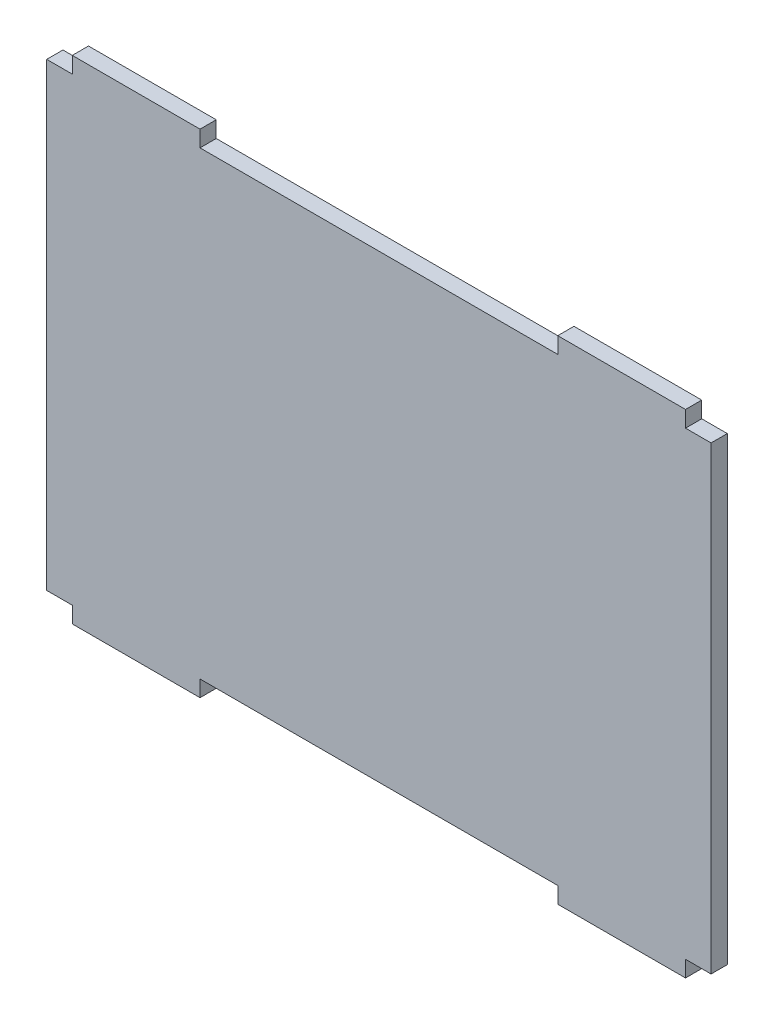
ISO-10303-21;
HEADER;
FILE_DESCRIPTION(('STEP AP214'),'2;1');
FILE_NAME('part.step','',(''),(''),'','','');
FILE_SCHEMA(('AUTOMOTIVE_DESIGN { 1 0 10303 214 1 1 1 1 }'));
ENDSEC;
DATA;
#1=APPLICATION_CONTEXT('core data for automotive mechanical design processes');
#2=APPLICATION_PROTOCOL_DEFINITION('international standard','automotive_design',2000,#1);
#3=PRODUCT_CONTEXT('',#1,'mechanical');
#4=PRODUCT('Part','Part','',(#3));
#5=PRODUCT_RELATED_PRODUCT_CATEGORY('part','',(#4));
#6=PRODUCT_DEFINITION_FORMATION('','',#4);
#7=PRODUCT_DEFINITION_CONTEXT('part definition',#1,'design');
#8=PRODUCT_DEFINITION('design','',#6,#7);
#9=PRODUCT_DEFINITION_SHAPE('','',#8);
#10=(LENGTH_UNIT() NAMED_UNIT(*) SI_UNIT(.MILLI.,.METRE.));
#11=(NAMED_UNIT(*) PLANE_ANGLE_UNIT() SI_UNIT($,.RADIAN.));
#12=(NAMED_UNIT(*) SI_UNIT($,.STERADIAN.) SOLID_ANGLE_UNIT());
#13=UNCERTAINTY_MEASURE_WITH_UNIT(LENGTH_MEASURE(1.E-05),#10,'distance_accuracy_value','');
#14=(GEOMETRIC_REPRESENTATION_CONTEXT(3) GLOBAL_UNCERTAINTY_ASSIGNED_CONTEXT((#13)) GLOBAL_UNIT_ASSIGNED_CONTEXT((#10,
#11,#12)) REPRESENTATION_CONTEXT('',''));
#15=CARTESIAN_POINT('',(0.,0.,0.));
#16=DIRECTION('',(0.,0.,1.));
#17=DIRECTION('',(1.,0.,0.));
#18=AXIS2_PLACEMENT_3D('',#15,#16,#17);
#19=CARTESIAN_POINT('',(0.,0.,3.175));
#20=DIRECTION('',(1.,0.,0.));
#21=DIRECTION('',(0.,0.,-1.));
#22=AXIS2_PLACEMENT_3D('',#19,#20,#21);
#23=PLANE('',#22);
#24=DIRECTION('',(0.,-1.,0.));
#25=VECTOR('',#24,1.);
#26=CARTESIAN_POINT('',(0.,0.,0.));
#27=LINE('',#26,#25);
#28=CARTESIAN_POINT('',(0.,90.,0.));
#29=VERTEX_POINT('',#28);
#30=CARTESIAN_POINT('',(0.,0.,0.));
#31=VERTEX_POINT('',#30);
#32=EDGE_CURVE('E201',#29,#31,#27,.T.);
#33=ORIENTED_EDGE('',*,*,#32,.T.);
#34=DIRECTION('',(0.,0.,-1.));
#35=VECTOR('',#34,1.);
#36=CARTESIAN_POINT('',(0.,0.,3.175));
#37=LINE('',#36,#35);
#38=CARTESIAN_POINT('',(0.,0.,3.175));
#39=VERTEX_POINT('',#38);
#40=EDGE_CURVE('E11',#39,#31,#37,.T.);
#41=ORIENTED_EDGE('',*,*,#40,.F.);
#42=DIRECTION('',(0.,-1.,0.));
#43=VECTOR('',#42,1.);
#44=CARTESIAN_POINT('',(0.,0.,3.175));
#45=LINE('',#44,#43);
#46=CARTESIAN_POINT('',(0.,90.,3.175));
#47=VERTEX_POINT('',#46);
#48=EDGE_CURVE('E239',#47,#39,#45,.T.);
#49=ORIENTED_EDGE('',*,*,#48,.F.);
#50=DIRECTION('',(0.,0.,-1.));
#51=VECTOR('',#50,1.);
#52=CARTESIAN_POINT('',(0.,90.,3.175));
#53=LINE('',#52,#51);
#54=EDGE_CURVE('E197',#47,#29,#53,.T.);
#55=ORIENTED_EDGE('',*,*,#54,.T.);
#56=EDGE_LOOP('',(#33,#41,#49,#55));
#57=FACE_BOUND('',#56,.T.);
#58=ADVANCED_FACE('F33',(#57),#23,.F.);
#59=CARTESIAN_POINT('',(0.,0.,3.175));
#60=DIRECTION('',(0.,1.,0.));
#61=DIRECTION('',(0.,0.,1.));
#62=AXIS2_PLACEMENT_3D('',#59,#60,#61);
#63=PLANE('',#62);
#64=DIRECTION('',(1.,0.,0.));
#65=VECTOR('',#64,1.);
#66=CARTESIAN_POINT('',(0.,0.,0.));
#67=LINE('',#66,#65);
#68=CARTESIAN_POINT('',(5.,0.,0.));
#69=VERTEX_POINT('',#68);
#70=EDGE_CURVE('E204',#31,#69,#67,.T.);
#71=ORIENTED_EDGE('',*,*,#70,.T.);
#72=DIRECTION('',(0.,0.,-1.));
#73=VECTOR('',#72,1.);
#74=CARTESIAN_POINT('',(5.,0.,3.175));
#75=LINE('',#74,#73);
#76=CARTESIAN_POINT('',(5.,0.,3.175));
#77=VERTEX_POINT('',#76);
#78=EDGE_CURVE('E41',#77,#69,#75,.T.);
#79=ORIENTED_EDGE('',*,*,#78,.F.);
#80=DIRECTION('',(1.,0.,0.));
#81=VECTOR('',#80,1.);
#82=CARTESIAN_POINT('',(0.,0.,3.175));
#83=LINE('',#82,#81);
#84=EDGE_CURVE('E128',#39,#77,#83,.T.);
#85=ORIENTED_EDGE('',*,*,#84,.F.);
#86=ORIENTED_EDGE('',*,*,#40,.T.);
#87=EDGE_LOOP('',(#71,#79,#85,#86));
#88=FACE_BOUND('',#87,.T.);
#89=ADVANCED_FACE('F357',(#88),#63,.F.);
#90=CARTESIAN_POINT('',(5.,0.,3.175));
#91=DIRECTION('',(1.,0.,0.));
#92=DIRECTION('',(0.,0.,-1.));
#93=AXIS2_PLACEMENT_3D('',#90,#91,#92);
#94=PLANE('',#93);
#95=DIRECTION('',(0.,-1.,0.));
#96=VECTOR('',#95,1.);
#97=CARTESIAN_POINT('',(5.,0.,0.));
#98=LINE('',#97,#96);
#99=CARTESIAN_POINT('',(5.,-3.17500000000003,0.));
#100=VERTEX_POINT('',#99);
#101=EDGE_CURVE('E206',#69,#100,#98,.T.);
#102=ORIENTED_EDGE('',*,*,#101,.T.);
#103=DIRECTION('',(0.,0.,-1.));
#104=VECTOR('',#103,1.);
#105=CARTESIAN_POINT('',(5.,-3.17500000000003,3.175));
#106=LINE('',#105,#104);
#107=CARTESIAN_POINT('',(5.,-3.17500000000003,3.175));
#108=VERTEX_POINT('',#107);
#109=EDGE_CURVE('E282',#108,#100,#106,.T.);
#110=ORIENTED_EDGE('',*,*,#109,.F.);
#111=DIRECTION('',(0.,-1.,0.));
#112=VECTOR('',#111,1.);
#113=CARTESIAN_POINT('',(5.,0.,3.175));
#114=LINE('',#113,#112);
#115=EDGE_CURVE('E290',#77,#108,#114,.T.);
#116=ORIENTED_EDGE('',*,*,#115,.F.);
#117=ORIENTED_EDGE('',*,*,#78,.T.);
#118=EDGE_LOOP('',(#102,#110,#116,#117));
#119=FACE_BOUND('',#118,.T.);
#120=ADVANCED_FACE('F288',(#119),#94,.F.);
#121=CARTESIAN_POINT('',(5.,-3.17500000000003,3.175));
#122=DIRECTION('',(0.,1.,0.));
#123=DIRECTION('',(0.,0.,1.));
#124=AXIS2_PLACEMENT_3D('',#121,#122,#123);
#125=PLANE('',#124);
#126=DIRECTION('',(1.,0.,0.));
#127=VECTOR('',#126,1.);
#128=CARTESIAN_POINT('',(5.,-3.17500000000003,0.));
#129=LINE('',#128,#127);
#130=CARTESIAN_POINT('',(30.,-3.17500000000003,0.));
#131=VERTEX_POINT('',#130);
#132=EDGE_CURVE('E208',#100,#131,#129,.T.);
#133=ORIENTED_EDGE('',*,*,#132,.T.);
#134=DIRECTION('',(0.,0.,-1.));
#135=VECTOR('',#134,1.);
#136=CARTESIAN_POINT('',(30.,-3.17500000000003,3.175));
#137=LINE('',#136,#135);
#138=CARTESIAN_POINT('',(30.,-3.17500000000003,3.175));
#139=VERTEX_POINT('',#138);
#140=EDGE_CURVE('E279',#139,#131,#137,.T.);
#141=ORIENTED_EDGE('',*,*,#140,.F.);
#142=DIRECTION('',(1.,0.,0.));
#143=VECTOR('',#142,1.);
#144=CARTESIAN_POINT('',(5.,-3.17500000000003,3.175));
#145=LINE('',#144,#143);
#146=EDGE_CURVE('E308',#108,#139,#145,.T.);
#147=ORIENTED_EDGE('',*,*,#146,.F.);
#148=ORIENTED_EDGE('',*,*,#109,.T.);
#149=EDGE_LOOP('',(#133,#141,#147,#148));
#150=FACE_BOUND('',#149,.T.);
#151=ADVANCED_FACE('F299',(#150),#125,.F.);
#152=CARTESIAN_POINT('',(30.,-3.17500000000003,3.175));
#153=DIRECTION('',(-1.,0.,0.));
#154=DIRECTION('',(0.,0.,1.));
#155=AXIS2_PLACEMENT_3D('',#152,#153,#154);
#156=PLANE('',#155);
#157=DIRECTION('',(0.,1.,0.));
#158=VECTOR('',#157,1.);
#159=CARTESIAN_POINT('',(30.,-3.17500000000003,0.));
#160=LINE('',#159,#158);
#161=CARTESIAN_POINT('',(30.,0.,0.));
#162=VERTEX_POINT('',#161);
#163=EDGE_CURVE('E210',#131,#162,#160,.T.);
#164=ORIENTED_EDGE('',*,*,#163,.T.);
#165=DIRECTION('',(0.,0.,-1.));
#166=VECTOR('',#165,1.);
#167=CARTESIAN_POINT('',(30.,0.,3.175));
#168=LINE('',#167,#166);
#169=CARTESIAN_POINT('',(30.,0.,3.175));
#170=VERTEX_POINT('',#169);
#171=EDGE_CURVE('E276',#170,#162,#168,.T.);
#172=ORIENTED_EDGE('',*,*,#171,.F.);
#173=DIRECTION('',(0.,1.,0.));
#174=VECTOR('',#173,1.);
#175=CARTESIAN_POINT('',(30.,-3.17500000000003,3.175));
#176=LINE('',#175,#174);
#177=EDGE_CURVE('E305',#139,#170,#176,.T.);
#178=ORIENTED_EDGE('',*,*,#177,.F.);
#179=ORIENTED_EDGE('',*,*,#140,.T.);
#180=EDGE_LOOP('',(#164,#172,#178,#179));
#181=FACE_BOUND('',#180,.T.);
#182=ADVANCED_FACE('F303',(#181),#156,.F.);
#183=CARTESIAN_POINT('',(30.,0.,3.175));
#184=DIRECTION('',(0.,1.,0.));
#185=DIRECTION('',(0.,0.,1.));
#186=AXIS2_PLACEMENT_3D('',#183,#184,#185);
#187=PLANE('',#186);
#188=DIRECTION('',(1.,0.,0.));
#189=VECTOR('',#188,1.);
#190=CARTESIAN_POINT('',(30.,0.,0.));
#191=LINE('',#190,#189);
#192=CARTESIAN_POINT('',(100.,0.,0.));
#193=VERTEX_POINT('',#192);
#194=EDGE_CURVE('E212',#162,#193,#191,.T.);
#195=ORIENTED_EDGE('',*,*,#194,.T.);
#196=DIRECTION('',(0.,0.,-1.));
#197=VECTOR('',#196,1.);
#198=CARTESIAN_POINT('',(100.,0.,3.175));
#199=LINE('',#198,#197);
#200=CARTESIAN_POINT('',(100.,0.,3.175));
#201=VERTEX_POINT('',#200);
#202=EDGE_CURVE('E273',#201,#193,#199,.T.);
#203=ORIENTED_EDGE('',*,*,#202,.F.);
#204=DIRECTION('',(1.,0.,0.));
#205=VECTOR('',#204,1.);
#206=CARTESIAN_POINT('',(30.,0.,3.175));
#207=LINE('',#206,#205);
#208=EDGE_CURVE('E307',#170,#201,#207,.T.);
#209=ORIENTED_EDGE('',*,*,#208,.F.);
#210=ORIENTED_EDGE('',*,*,#171,.T.);
#211=EDGE_LOOP('',(#195,#203,#209,#210));
#212=FACE_BOUND('',#211,.T.);
#213=ADVANCED_FACE('F370',(#212),#187,.F.);
#214=CARTESIAN_POINT('',(100.,-3.17500000000001,3.175));
#215=DIRECTION('',(1.,0.,0.));
#216=DIRECTION('',(0.,0.,-1.));
#217=AXIS2_PLACEMENT_3D('',#214,#215,#216);
#218=PLANE('',#217);
#219=DIRECTION('',(0.,-1.,0.));
#220=VECTOR('',#219,1.);
#221=CARTESIAN_POINT('',(100.,-3.17500000000001,0.));
#222=LINE('',#221,#220);
#223=CARTESIAN_POINT('',(100.,-3.17500000000001,0.));
#224=VERTEX_POINT('',#223);
#225=EDGE_CURVE('E214',#193,#224,#222,.T.);
#226=ORIENTED_EDGE('',*,*,#225,.T.);
#227=DIRECTION('',(0.,0.,-1.));
#228=VECTOR('',#227,1.);
#229=CARTESIAN_POINT('',(100.,-3.17500000000001,3.175));
#230=LINE('',#229,#228);
#231=CARTESIAN_POINT('',(100.,-3.17500000000001,3.175));
#232=VERTEX_POINT('',#231);
#233=EDGE_CURVE('E270',#232,#224,#230,.T.);
#234=ORIENTED_EDGE('',*,*,#233,.F.);
#235=DIRECTION('',(0.,-1.,0.));
#236=VECTOR('',#235,1.);
#237=CARTESIAN_POINT('',(100.,-3.17500000000001,3.175));
#238=LINE('',#237,#236);
#239=EDGE_CURVE('E310',#201,#232,#238,.T.);
#240=ORIENTED_EDGE('',*,*,#239,.F.);
#241=ORIENTED_EDGE('',*,*,#202,.T.);
#242=EDGE_LOOP('',(#226,#234,#240,#241));
#243=FACE_BOUND('',#242,.T.);
#244=ADVANCED_FACE('F373',(#243),#218,.F.);
#245=CARTESIAN_POINT('',(125.,-3.17500000000001,3.175));
#246=DIRECTION('',(0.,1.,0.));
#247=DIRECTION('',(-1.,0.,0.));
#248=AXIS2_PLACEMENT_3D('',#245,#246,#247);
#249=PLANE('',#248);
#250=DIRECTION('',(1.,0.,0.));
#251=VECTOR('',#250,1.);
#252=CARTESIAN_POINT('',(125.,-3.17500000000001,0.));
#253=LINE('',#252,#251);
#254=CARTESIAN_POINT('',(125.,-3.17500000000001,0.));
#255=VERTEX_POINT('',#254);
#256=EDGE_CURVE('E216',#224,#255,#253,.T.);
#257=ORIENTED_EDGE('',*,*,#256,.T.);
#258=DIRECTION('',(0.,0.,-1.));
#259=VECTOR('',#258,1.);
#260=CARTESIAN_POINT('',(125.,-3.17500000000001,3.175));
#261=LINE('',#260,#259);
#262=CARTESIAN_POINT('',(125.,-3.17500000000001,3.175));
#263=VERTEX_POINT('',#262);
#264=EDGE_CURVE('E267',#263,#255,#261,.T.);
#265=ORIENTED_EDGE('',*,*,#264,.F.);
#266=DIRECTION('',(1.,0.,0.));
#267=VECTOR('',#266,1.);
#268=CARTESIAN_POINT('',(125.,-3.17500000000001,3.175));
#269=LINE('',#268,#267);
#270=EDGE_CURVE('E316',#232,#263,#269,.T.);
#271=ORIENTED_EDGE('',*,*,#270,.F.);
#272=ORIENTED_EDGE('',*,*,#233,.T.);
#273=EDGE_LOOP('',(#257,#265,#271,#272));
#274=FACE_BOUND('',#273,.T.);
#275=ADVANCED_FACE('F377',(#274),#249,.F.);
#276=CARTESIAN_POINT('',(125.,0.,3.175));
#277=DIRECTION('',(-1.,0.,0.));
#278=DIRECTION('',(0.,0.,1.));
#279=AXIS2_PLACEMENT_3D('',#276,#277,#278);
#280=PLANE('',#279);
#281=DIRECTION('',(0.,1.,0.));
#282=VECTOR('',#281,1.);
#283=CARTESIAN_POINT('',(125.,0.,0.));
#284=LINE('',#283,#282);
#285=CARTESIAN_POINT('',(125.,0.,0.));
#286=VERTEX_POINT('',#285);
#287=EDGE_CURVE('E218',#255,#286,#284,.T.);
#288=ORIENTED_EDGE('',*,*,#287,.T.);
#289=DIRECTION('',(0.,0.,-1.));
#290=VECTOR('',#289,1.);
#291=CARTESIAN_POINT('',(125.,0.,3.175));
#292=LINE('',#291,#290);
#293=CARTESIAN_POINT('',(125.,0.,3.175));
#294=VERTEX_POINT('',#293);
#295=EDGE_CURVE('E264',#294,#286,#292,.T.);
#296=ORIENTED_EDGE('',*,*,#295,.F.);
#297=DIRECTION('',(0.,1.,0.));
#298=VECTOR('',#297,1.);
#299=CARTESIAN_POINT('',(125.,0.,3.175));
#300=LINE('',#299,#298);
#301=EDGE_CURVE('E318',#263,#294,#300,.T.);
#302=ORIENTED_EDGE('',*,*,#301,.F.);
#303=ORIENTED_EDGE('',*,*,#264,.T.);
#304=EDGE_LOOP('',(#288,#296,#302,#303));
#305=FACE_BOUND('',#304,.T.);
#306=ADVANCED_FACE('F381',(#305),#280,.F.);
#307=CARTESIAN_POINT('',(125.,0.,3.175));
#308=DIRECTION('',(0.,1.,0.));
#309=DIRECTION('',(0.,0.,1.));
#310=AXIS2_PLACEMENT_3D('',#307,#308,#309);
#311=PLANE('',#310);
#312=DIRECTION('',(1.,0.,0.));
#313=VECTOR('',#312,1.);
#314=CARTESIAN_POINT('',(125.,0.,0.));
#315=LINE('',#314,#313);
#316=CARTESIAN_POINT('',(130.,0.,0.));
#317=VERTEX_POINT('',#316);
#318=EDGE_CURVE('E220',#286,#317,#315,.T.);
#319=ORIENTED_EDGE('',*,*,#318,.T.);
#320=DIRECTION('',(0.,0.,-1.));
#321=VECTOR('',#320,1.);
#322=CARTESIAN_POINT('',(130.,0.,3.175));
#323=LINE('',#322,#321);
#324=CARTESIAN_POINT('',(130.,0.,3.175));
#325=VERTEX_POINT('',#324);
#326=EDGE_CURVE('E261',#325,#317,#323,.T.);
#327=ORIENTED_EDGE('',*,*,#326,.F.);
#328=DIRECTION('',(1.,0.,0.));
#329=VECTOR('',#328,1.);
#330=CARTESIAN_POINT('',(125.,0.,3.175));
#331=LINE('',#330,#329);
#332=EDGE_CURVE('E320',#294,#325,#331,.T.);
#333=ORIENTED_EDGE('',*,*,#332,.F.);
#334=ORIENTED_EDGE('',*,*,#295,.T.);
#335=EDGE_LOOP('',(#319,#327,#333,#334));
#336=FACE_BOUND('',#335,.T.);
#337=ADVANCED_FACE('F385',(#336),#311,.F.);
#338=CARTESIAN_POINT('',(130.,0.,3.175));
#339=DIRECTION('',(-1.,0.,0.));
#340=DIRECTION('',(0.,0.,1.));
#341=AXIS2_PLACEMENT_3D('',#338,#339,#340);
#342=PLANE('',#341);
#343=DIRECTION('',(0.,1.,0.));
#344=VECTOR('',#343,1.);
#345=CARTESIAN_POINT('',(130.,0.,0.));
#346=LINE('',#345,#344);
#347=CARTESIAN_POINT('',(130.,90.,0.));
#348=VERTEX_POINT('',#347);
#349=EDGE_CURVE('E222',#317,#348,#346,.T.);
#350=ORIENTED_EDGE('',*,*,#349,.T.);
#351=DIRECTION('',(0.,0.,-1.));
#352=VECTOR('',#351,1.);
#353=CARTESIAN_POINT('',(130.,90.,3.175));
#354=LINE('',#353,#352);
#355=CARTESIAN_POINT('',(130.,90.,3.175));
#356=VERTEX_POINT('',#355);
#357=EDGE_CURVE('E258',#356,#348,#354,.T.);
#358=ORIENTED_EDGE('',*,*,#357,.F.);
#359=DIRECTION('',(0.,1.,0.));
#360=VECTOR('',#359,1.);
#361=CARTESIAN_POINT('',(130.,0.,3.175));
#362=LINE('',#361,#360);
#363=EDGE_CURVE('E322',#325,#356,#362,.T.);
#364=ORIENTED_EDGE('',*,*,#363,.F.);
#365=ORIENTED_EDGE('',*,*,#326,.T.);
#366=EDGE_LOOP('',(#350,#358,#364,#365));
#367=FACE_BOUND('',#366,.T.);
#368=ADVANCED_FACE('F389',(#367),#342,.F.);
#369=CARTESIAN_POINT('',(125.,90.,3.175));
#370=DIRECTION('',(0.,-1.,0.));
#371=DIRECTION('',(0.,0.,-1.));
#372=AXIS2_PLACEMENT_3D('',#369,#370,#371);
#373=PLANE('',#372);
#374=DIRECTION('',(-1.,0.,0.));
#375=VECTOR('',#374,1.);
#376=CARTESIAN_POINT('',(125.,90.,0.));
#377=LINE('',#376,#375);
#378=CARTESIAN_POINT('',(125.,90.,0.));
#379=VERTEX_POINT('',#378);
#380=EDGE_CURVE('E224',#348,#379,#377,.T.);
#381=ORIENTED_EDGE('',*,*,#380,.T.);
#382=DIRECTION('',(0.,0.,-1.));
#383=VECTOR('',#382,1.);
#384=CARTESIAN_POINT('',(125.,90.,3.175));
#385=LINE('',#384,#383);
#386=CARTESIAN_POINT('',(125.,90.,3.175));
#387=VERTEX_POINT('',#386);
#388=EDGE_CURVE('E255',#387,#379,#385,.T.);
#389=ORIENTED_EDGE('',*,*,#388,.F.);
#390=DIRECTION('',(-1.,0.,0.));
#391=VECTOR('',#390,1.);
#392=CARTESIAN_POINT('',(125.,90.,3.175));
#393=LINE('',#392,#391);
#394=EDGE_CURVE('E324',#356,#387,#393,.T.);
#395=ORIENTED_EDGE('',*,*,#394,.F.);
#396=ORIENTED_EDGE('',*,*,#357,.T.);
#397=EDGE_LOOP('',(#381,#389,#395,#396));
#398=FACE_BOUND('',#397,.T.);
#399=ADVANCED_FACE('F393',(#398),#373,.F.);
#400=CARTESIAN_POINT('',(125.,90.,3.175));
#401=DIRECTION('',(-1.,0.,0.));
#402=DIRECTION('',(0.,0.,1.));
#403=AXIS2_PLACEMENT_3D('',#400,#401,#402);
#404=PLANE('',#403);
#405=DIRECTION('',(0.,1.,0.));
#406=VECTOR('',#405,1.);
#407=CARTESIAN_POINT('',(125.,90.,0.));
#408=LINE('',#407,#406);
#409=CARTESIAN_POINT('',(125.,93.175,0.));
#410=VERTEX_POINT('',#409);
#411=EDGE_CURVE('E226',#379,#410,#408,.T.);
#412=ORIENTED_EDGE('',*,*,#411,.T.);
#413=DIRECTION('',(0.,0.,-1.));
#414=VECTOR('',#413,1.);
#415=CARTESIAN_POINT('',(125.,93.175,3.175));
#416=LINE('',#415,#414);
#417=CARTESIAN_POINT('',(125.,93.175,3.175));
#418=VERTEX_POINT('',#417);
#419=EDGE_CURVE('E252',#418,#410,#416,.T.);
#420=ORIENTED_EDGE('',*,*,#419,.F.);
#421=DIRECTION('',(0.,1.,0.));
#422=VECTOR('',#421,1.);
#423=CARTESIAN_POINT('',(125.,90.,3.175));
#424=LINE('',#423,#422);
#425=EDGE_CURVE('E326',#387,#418,#424,.T.);
#426=ORIENTED_EDGE('',*,*,#425,.F.);
#427=ORIENTED_EDGE('',*,*,#388,.T.);
#428=EDGE_LOOP('',(#412,#420,#426,#427));
#429=FACE_BOUND('',#428,.T.);
#430=ADVANCED_FACE('F397',(#429),#404,.F.);
#431=CARTESIAN_POINT('',(125.,93.175,3.175));
#432=DIRECTION('',(0.,-1.,0.));
#433=DIRECTION('',(0.,0.,-1.));
#434=AXIS2_PLACEMENT_3D('',#431,#432,#433);
#435=PLANE('',#434);
#436=DIRECTION('',(-1.,0.,0.));
#437=VECTOR('',#436,1.);
#438=CARTESIAN_POINT('',(125.,93.175,0.));
#439=LINE('',#438,#437);
#440=CARTESIAN_POINT('',(100.,93.175,0.));
#441=VERTEX_POINT('',#440);
#442=EDGE_CURVE('E228',#410,#441,#439,.T.);
#443=ORIENTED_EDGE('',*,*,#442,.T.);
#444=DIRECTION('',(0.,0.,-1.));
#445=VECTOR('',#444,1.);
#446=CARTESIAN_POINT('',(100.,93.175,3.175));
#447=LINE('',#446,#445);
#448=CARTESIAN_POINT('',(100.,93.175,3.175));
#449=VERTEX_POINT('',#448);
#450=EDGE_CURVE('E249',#449,#441,#447,.T.);
#451=ORIENTED_EDGE('',*,*,#450,.F.);
#452=DIRECTION('',(-1.,0.,0.));
#453=VECTOR('',#452,1.);
#454=CARTESIAN_POINT('',(125.,93.175,3.175));
#455=LINE('',#454,#453);
#456=EDGE_CURVE('E328',#418,#449,#455,.T.);
#457=ORIENTED_EDGE('',*,*,#456,.F.);
#458=ORIENTED_EDGE('',*,*,#419,.T.);
#459=EDGE_LOOP('',(#443,#451,#457,#458));
#460=FACE_BOUND('',#459,.T.);
#461=ADVANCED_FACE('F401',(#460),#435,.F.);
#462=CARTESIAN_POINT('',(100.,93.175,3.175));
#463=DIRECTION('',(1.,0.,0.));
#464=DIRECTION('',(0.,0.,-1.));
#465=AXIS2_PLACEMENT_3D('',#462,#463,#464);
#466=PLANE('',#465);
#467=DIRECTION('',(0.,-1.,0.));
#468=VECTOR('',#467,1.);
#469=CARTESIAN_POINT('',(100.,93.175,0.));
#470=LINE('',#469,#468);
#471=CARTESIAN_POINT('',(100.,90.,0.));
#472=VERTEX_POINT('',#471);
#473=EDGE_CURVE('E230',#441,#472,#470,.T.);
#474=ORIENTED_EDGE('',*,*,#473,.T.);
#475=DIRECTION('',(0.,0.,-1.));
#476=VECTOR('',#475,1.);
#477=CARTESIAN_POINT('',(100.,90.,3.175));
#478=LINE('',#477,#476);
#479=CARTESIAN_POINT('',(100.,90.,3.175));
#480=VERTEX_POINT('',#479);
#481=EDGE_CURVE('E246',#480,#472,#478,.T.);
#482=ORIENTED_EDGE('',*,*,#481,.F.);
#483=DIRECTION('',(0.,-1.,0.));
#484=VECTOR('',#483,1.);
#485=CARTESIAN_POINT('',(100.,93.175,3.175));
#486=LINE('',#485,#484);
#487=EDGE_CURVE('E330',#449,#480,#486,.T.);
#488=ORIENTED_EDGE('',*,*,#487,.F.);
#489=ORIENTED_EDGE('',*,*,#450,.T.);
#490=EDGE_LOOP('',(#474,#482,#488,#489));
#491=FACE_BOUND('',#490,.T.);
#492=ADVANCED_FACE('F405',(#491),#466,.F.);
#493=CARTESIAN_POINT('',(30.,90.,3.175));
#494=DIRECTION('',(0.,-1.,0.));
#495=DIRECTION('',(0.,0.,-1.));
#496=AXIS2_PLACEMENT_3D('',#493,#494,#495);
#497=PLANE('',#496);
#498=DIRECTION('',(-1.,0.,0.));
#499=VECTOR('',#498,1.);
#500=CARTESIAN_POINT('',(30.,90.,0.));
#501=LINE('',#500,#499);
#502=CARTESIAN_POINT('',(30.,90.,0.));
#503=VERTEX_POINT('',#502);
#504=EDGE_CURVE('E232',#472,#503,#501,.T.);
#505=ORIENTED_EDGE('',*,*,#504,.T.);
#506=DIRECTION('',(0.,0.,-1.));
#507=VECTOR('',#506,1.);
#508=CARTESIAN_POINT('',(30.,90.,3.175));
#509=LINE('',#508,#507);
#510=CARTESIAN_POINT('',(30.,90.,3.175));
#511=VERTEX_POINT('',#510);
#512=EDGE_CURVE('E243',#511,#503,#509,.T.);
#513=ORIENTED_EDGE('',*,*,#512,.F.);
#514=DIRECTION('',(-1.,0.,0.));
#515=VECTOR('',#514,1.);
#516=CARTESIAN_POINT('',(30.,90.,3.175));
#517=LINE('',#516,#515);
#518=EDGE_CURVE('E332',#480,#511,#517,.T.);
#519=ORIENTED_EDGE('',*,*,#518,.F.);
#520=ORIENTED_EDGE('',*,*,#481,.T.);
#521=EDGE_LOOP('',(#505,#513,#519,#520));
#522=FACE_BOUND('',#521,.T.);
#523=ADVANCED_FACE('F338',(#522),#497,.F.);
#524=CARTESIAN_POINT('',(30.,90.,3.175));
#525=DIRECTION('',(-1.,0.,0.));
#526=DIRECTION('',(0.,-1.,0.));
#527=AXIS2_PLACEMENT_3D('',#524,#525,#526);
#528=PLANE('',#527);
#529=DIRECTION('',(0.,1.,0.));
#530=VECTOR('',#529,1.);
#531=CARTESIAN_POINT('',(30.,90.,0.));
#532=LINE('',#531,#530);
#533=CARTESIAN_POINT('',(30.,93.175,0.));
#534=VERTEX_POINT('',#533);
#535=EDGE_CURVE('E234',#503,#534,#532,.T.);
#536=ORIENTED_EDGE('',*,*,#535,.T.);
#537=DIRECTION('',(0.,0.,-1.));
#538=VECTOR('',#537,1.);
#539=CARTESIAN_POINT('',(30.,93.175,3.175));
#540=LINE('',#539,#538);
#541=CARTESIAN_POINT('',(30.,93.175,3.175));
#542=VERTEX_POINT('',#541);
#543=EDGE_CURVE('E192',#542,#534,#540,.T.);
#544=ORIENTED_EDGE('',*,*,#543,.F.);
#545=DIRECTION('',(0.,1.,0.));
#546=VECTOR('',#545,1.);
#547=CARTESIAN_POINT('',(30.,90.,3.175));
#548=LINE('',#547,#546);
#549=EDGE_CURVE('E183',#511,#542,#548,.T.);
#550=ORIENTED_EDGE('',*,*,#549,.F.);
#551=ORIENTED_EDGE('',*,*,#512,.T.);
#552=EDGE_LOOP('',(#536,#544,#550,#551));
#553=FACE_BOUND('',#552,.T.);
#554=ADVANCED_FACE('F342',(#553),#528,.F.);
#555=CARTESIAN_POINT('',(30.,93.175,3.175));
#556=DIRECTION('',(0.,-1.,0.));
#557=DIRECTION('',(0.,0.,-1.));
#558=AXIS2_PLACEMENT_3D('',#555,#556,#557);
#559=PLANE('',#558);
#560=DIRECTION('',(-1.,0.,0.));
#561=VECTOR('',#560,1.);
#562=CARTESIAN_POINT('',(30.,93.175,0.));
#563=LINE('',#562,#561);
#564=CARTESIAN_POINT('',(5.,93.175,0.));
#565=VERTEX_POINT('',#564);
#566=EDGE_CURVE('E191',#534,#565,#563,.T.);
#567=ORIENTED_EDGE('',*,*,#566,.T.);
#568=DIRECTION('',(0.,0.,-1.));
#569=VECTOR('',#568,1.);
#570=CARTESIAN_POINT('',(5.,93.175,3.175));
#571=LINE('',#570,#569);
#572=CARTESIAN_POINT('',(5.,93.175,3.175));
#573=VERTEX_POINT('',#572);
#574=EDGE_CURVE('E188',#573,#565,#571,.T.);
#575=ORIENTED_EDGE('',*,*,#574,.F.);
#576=DIRECTION('',(-1.,0.,0.));
#577=VECTOR('',#576,1.);
#578=CARTESIAN_POINT('',(30.,93.175,3.175));
#579=LINE('',#578,#577);
#580=EDGE_CURVE('E177',#542,#573,#579,.T.);
#581=ORIENTED_EDGE('',*,*,#580,.F.);
#582=ORIENTED_EDGE('',*,*,#543,.T.);
#583=EDGE_LOOP('',(#567,#575,#581,#582));
#584=FACE_BOUND('',#583,.T.);
#585=ADVANCED_FACE('F189',(#584),#559,.F.);
#586=CARTESIAN_POINT('',(5.,93.175,3.175));
#587=DIRECTION('',(1.,0.,0.));
#588=DIRECTION('',(0.,0.,-1.));
#589=AXIS2_PLACEMENT_3D('',#586,#587,#588);
#590=PLANE('',#589);
#591=DIRECTION('',(0.,-1.,0.));
#592=VECTOR('',#591,1.);
#593=CARTESIAN_POINT('',(5.,93.175,0.));
#594=LINE('',#593,#592);
#595=CARTESIAN_POINT('',(5.,90.,0.));
#596=VERTEX_POINT('',#595);
#597=EDGE_CURVE('E114',#565,#596,#594,.T.);
#598=ORIENTED_EDGE('',*,*,#597,.T.);
#599=DIRECTION('',(0.,0.,-1.));
#600=VECTOR('',#599,1.);
#601=CARTESIAN_POINT('',(5.,90.,3.175));
#602=LINE('',#601,#600);
#603=CARTESIAN_POINT('',(5.,90.,3.175));
#604=VERTEX_POINT('',#603);
#605=EDGE_CURVE('E193',#604,#596,#602,.T.);
#606=ORIENTED_EDGE('',*,*,#605,.F.);
#607=DIRECTION('',(0.,-1.,0.));
#608=VECTOR('',#607,1.);
#609=CARTESIAN_POINT('',(5.,93.175,3.175));
#610=LINE('',#609,#608);
#611=EDGE_CURVE('E181',#573,#604,#610,.T.);
#612=ORIENTED_EDGE('',*,*,#611,.F.);
#613=ORIENTED_EDGE('',*,*,#574,.T.);
#614=EDGE_LOOP('',(#598,#606,#612,#613));
#615=FACE_BOUND('',#614,.T.);
#616=ADVANCED_FACE('F195',(#615),#590,.F.);
#617=CARTESIAN_POINT('',(0.,90.,3.175));
#618=DIRECTION('',(0.,-1.,0.));
#619=DIRECTION('',(0.,0.,-1.));
#620=AXIS2_PLACEMENT_3D('',#617,#618,#619);
#621=PLANE('',#620);
#622=DIRECTION('',(-1.,0.,0.));
#623=VECTOR('',#622,1.);
#624=CARTESIAN_POINT('',(0.,90.,0.));
#625=LINE('',#624,#623);
#626=EDGE_CURVE('E120',#596,#29,#625,.T.);
#627=ORIENTED_EDGE('',*,*,#626,.T.);
#628=ORIENTED_EDGE('',*,*,#54,.F.);
#629=DIRECTION('',(-1.,0.,0.));
#630=VECTOR('',#629,1.);
#631=CARTESIAN_POINT('',(0.,90.,3.175));
#632=LINE('',#631,#630);
#633=EDGE_CURVE('E49',#604,#47,#632,.T.);
#634=ORIENTED_EDGE('',*,*,#633,.F.);
#635=ORIENTED_EDGE('',*,*,#605,.T.);
#636=EDGE_LOOP('',(#627,#628,#634,#635));
#637=FACE_BOUND('',#636,.T.);
#638=ADVANCED_FACE('F346',(#637),#621,.F.);
#639=CARTESIAN_POINT('',(0.,0.,3.175));
#640=DIRECTION('',(0.,0.,-1.));
#641=DIRECTION('',(-1.,0.,0.));
#642=AXIS2_PLACEMENT_3D('',#639,#640,#641);
#643=PLANE('',#642);
#644=ORIENTED_EDGE('',*,*,#48,.T.);
#645=ORIENTED_EDGE('',*,*,#84,.T.);
#646=ORIENTED_EDGE('',*,*,#115,.T.);
#647=ORIENTED_EDGE('',*,*,#146,.T.);
#648=ORIENTED_EDGE('',*,*,#177,.T.);
#649=ORIENTED_EDGE('',*,*,#208,.T.);
#650=ORIENTED_EDGE('',*,*,#239,.T.);
#651=ORIENTED_EDGE('',*,*,#270,.T.);
#652=ORIENTED_EDGE('',*,*,#301,.T.);
#653=ORIENTED_EDGE('',*,*,#332,.T.);
#654=ORIENTED_EDGE('',*,*,#363,.T.);
#655=ORIENTED_EDGE('',*,*,#394,.T.);
#656=ORIENTED_EDGE('',*,*,#425,.T.);
#657=ORIENTED_EDGE('',*,*,#456,.T.);
#658=ORIENTED_EDGE('',*,*,#487,.T.);
#659=ORIENTED_EDGE('',*,*,#518,.T.);
#660=ORIENTED_EDGE('',*,*,#549,.T.);
#661=ORIENTED_EDGE('',*,*,#580,.T.);
#662=ORIENTED_EDGE('',*,*,#611,.T.);
#663=ORIENTED_EDGE('',*,*,#633,.T.);
#664=EDGE_LOOP('',(#644,#645,#646,#647,#648,#649,#650,#651,#652,#653,#654,#655,#656,#657,#658,
#659,#660,#661,#662,#663));
#665=FACE_BOUND('',#664,.T.);
#666=ADVANCED_FACE('F179',(#665),#643,.F.);
#667=CARTESIAN_POINT('',(0.,0.,0.));
#668=DIRECTION('',(0.,0.,-1.));
#669=DIRECTION('',(-1.,0.,0.));
#670=AXIS2_PLACEMENT_3D('',#667,#668,#669);
#671=PLANE('',#670);
#672=ORIENTED_EDGE('',*,*,#32,.F.);
#673=ORIENTED_EDGE('',*,*,#626,.F.);
#674=ORIENTED_EDGE('',*,*,#597,.F.);
#675=ORIENTED_EDGE('',*,*,#566,.F.);
#676=ORIENTED_EDGE('',*,*,#535,.F.);
#677=ORIENTED_EDGE('',*,*,#504,.F.);
#678=ORIENTED_EDGE('',*,*,#473,.F.);
#679=ORIENTED_EDGE('',*,*,#442,.F.);
#680=ORIENTED_EDGE('',*,*,#411,.F.);
#681=ORIENTED_EDGE('',*,*,#380,.F.);
#682=ORIENTED_EDGE('',*,*,#349,.F.);
#683=ORIENTED_EDGE('',*,*,#318,.F.);
#684=ORIENTED_EDGE('',*,*,#287,.F.);
#685=ORIENTED_EDGE('',*,*,#256,.F.);
#686=ORIENTED_EDGE('',*,*,#225,.F.);
#687=ORIENTED_EDGE('',*,*,#194,.F.);
#688=ORIENTED_EDGE('',*,*,#163,.F.);
#689=ORIENTED_EDGE('',*,*,#132,.F.);
#690=ORIENTED_EDGE('',*,*,#101,.F.);
#691=ORIENTED_EDGE('',*,*,#70,.F.);
#692=EDGE_LOOP('',(#672,#673,#674,#675,#676,#677,#678,#679,#680,#681,#682,#683,#684,#685,#686,
#687,#688,#689,#690,#691));
#693=FACE_BOUND('',#692,.T.);
#694=ADVANCED_FACE('F294',(#693),#671,.T.);
#695=CLOSED_SHELL('',(#58,#89,#120,#151,#182,#213,#244,#275,#306,#337,#368,#399,#430,#461,#492,
#523,#554,#585,#616,#638,#666,#694));
#696=MANIFOLD_SOLID_BREP('B2',#695);
#697=ADVANCED_BREP_SHAPE_REPRESENTATION('',(#18,#696),#14);
#698=SHAPE_DEFINITION_REPRESENTATION(#9,#697);
ENDSEC;
END-ISO-10303-21;
